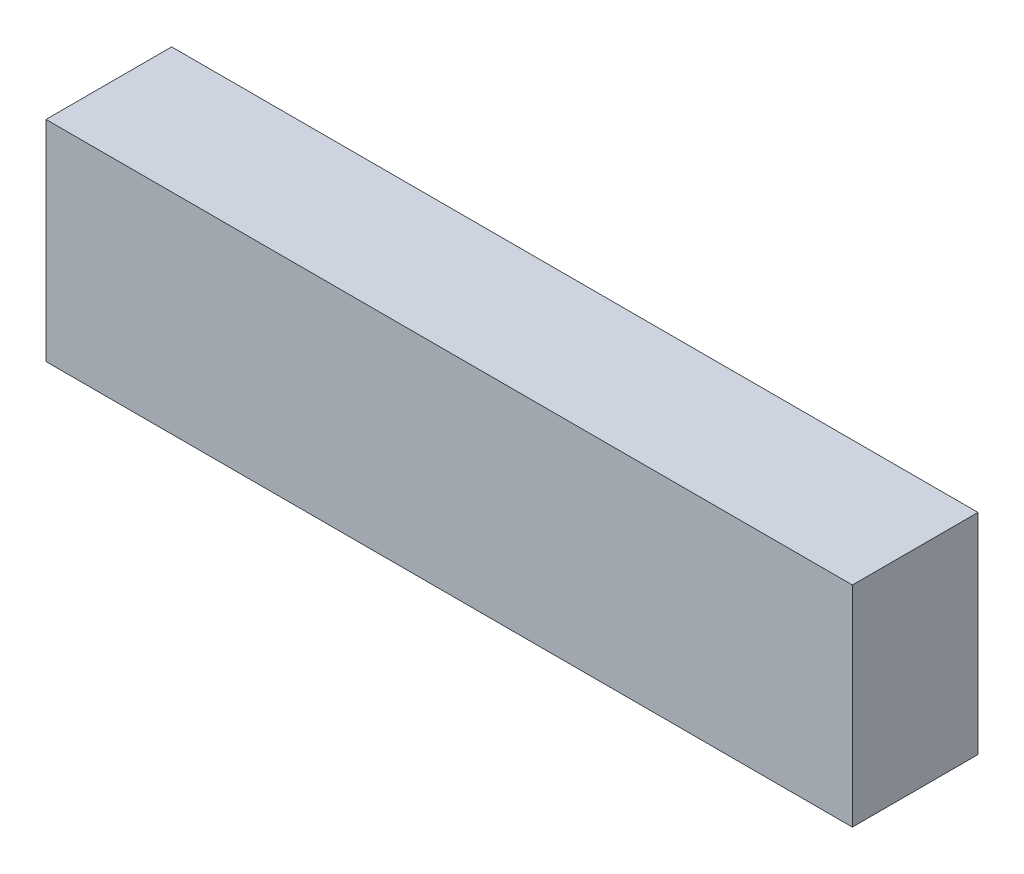
ISO-10303-21;
HEADER;
FILE_DESCRIPTION(('STEP AP214'),'2;1');
FILE_NAME('part.step','',(''),(''),'','','');
FILE_SCHEMA(('AUTOMOTIVE_DESIGN { 1 0 10303 214 1 1 1 1 }'));
ENDSEC;
DATA;
#1=APPLICATION_CONTEXT('core data for automotive mechanical design processes');
#2=APPLICATION_PROTOCOL_DEFINITION('international standard','automotive_design',2000,#1);
#3=PRODUCT_CONTEXT('',#1,'mechanical');
#4=PRODUCT('Part','Part','',(#3));
#5=PRODUCT_RELATED_PRODUCT_CATEGORY('part','',(#4));
#6=PRODUCT_DEFINITION_FORMATION('','',#4);
#7=PRODUCT_DEFINITION_CONTEXT('part definition',#1,'design');
#8=PRODUCT_DEFINITION('design','',#6,#7);
#9=PRODUCT_DEFINITION_SHAPE('','',#8);
#10=(LENGTH_UNIT() NAMED_UNIT(*) SI_UNIT(.MILLI.,.METRE.));
#11=(NAMED_UNIT(*) PLANE_ANGLE_UNIT() SI_UNIT($,.RADIAN.));
#12=(NAMED_UNIT(*) SI_UNIT($,.STERADIAN.) SOLID_ANGLE_UNIT());
#13=UNCERTAINTY_MEASURE_WITH_UNIT(LENGTH_MEASURE(1.E-05),#10,'distance_accuracy_value','');
#14=(GEOMETRIC_REPRESENTATION_CONTEXT(3) GLOBAL_UNCERTAINTY_ASSIGNED_CONTEXT((#13)) GLOBAL_UNIT_ASSIGNED_CONTEXT((#10,
#11,#12)) REPRESENTATION_CONTEXT('',''));
#15=CARTESIAN_POINT('',(0.,0.,0.));
#16=DIRECTION('',(0.,0.,1.));
#17=DIRECTION('',(1.,0.,0.));
#18=AXIS2_PLACEMENT_3D('',#15,#16,#17);
#19=CARTESIAN_POINT('',(32.5045,77.5714301256037,7.25));
#20=DIRECTION('',(1.,0.,0.));
#21=DIRECTION('',(0.,0.,-1.));
#22=AXIS2_PLACEMENT_3D('',#19,#20,#21);
#23=PLANE('',#22);
#24=DIRECTION('',(0.,-1.,0.));
#25=VECTOR('',#24,1.);
#26=CARTESIAN_POINT('',(32.5045,77.5714301256037,0.));
#27=LINE('',#26,#25);
#28=CARTESIAN_POINT('',(32.5045,77.5714301256037,0.));
#29=VERTEX_POINT('',#28);
#30=CARTESIAN_POINT('',(32.5045,65.47,0.));
#31=VERTEX_POINT('',#30);
#32=EDGE_CURVE('E149',#29,#31,#27,.T.);
#33=ORIENTED_EDGE('',*,*,#32,.T.);
#34=DIRECTION('',(0.,0.,-1.));
#35=VECTOR('',#34,1.);
#36=CARTESIAN_POINT('',(32.5045,65.47,7.25));
#37=LINE('',#36,#35);
#38=CARTESIAN_POINT('',(32.5045,65.47,7.25));
#39=VERTEX_POINT('',#38);
#40=EDGE_CURVE('E11',#39,#31,#37,.T.);
#41=ORIENTED_EDGE('',*,*,#40,.F.);
#42=DIRECTION('',(0.,-1.,0.));
#43=VECTOR('',#42,1.);
#44=CARTESIAN_POINT('',(32.5045,77.5714301256037,7.25));
#45=LINE('',#44,#43);
#46=CARTESIAN_POINT('',(32.5045,77.5714301256037,7.25));
#47=VERTEX_POINT('',#46);
#48=EDGE_CURVE('E140',#47,#39,#45,.T.);
#49=ORIENTED_EDGE('',*,*,#48,.F.);
#50=DIRECTION('',(0.,0.,-1.));
#51=VECTOR('',#50,1.);
#52=CARTESIAN_POINT('',(32.5045,77.5714301256037,7.25));
#53=LINE('',#52,#51);
#54=EDGE_CURVE('E55',#47,#29,#53,.T.);
#55=ORIENTED_EDGE('',*,*,#54,.T.);
#56=EDGE_LOOP('',(#33,#41,#49,#55));
#57=FACE_BOUND('',#56,.T.);
#58=ADVANCED_FACE('F32',(#57),#23,.F.);
#59=CARTESIAN_POINT('',(32.5045,65.47,7.25));
#60=DIRECTION('',(0.,1.,0.));
#61=DIRECTION('',(0.,0.,1.));
#62=AXIS2_PLACEMENT_3D('',#59,#60,#61);
#63=PLANE('',#62);
#64=DIRECTION('',(1.,0.,0.));
#65=VECTOR('',#64,1.);
#66=CARTESIAN_POINT('',(32.5045,65.47,0.));
#67=LINE('',#66,#65);
#68=CARTESIAN_POINT('',(79.0368014902547,65.47,0.));
#69=VERTEX_POINT('',#68);
#70=EDGE_CURVE('E151',#31,#69,#67,.T.);
#71=ORIENTED_EDGE('',*,*,#70,.T.);
#72=DIRECTION('',(0.,0.,-1.));
#73=VECTOR('',#72,1.);
#74=CARTESIAN_POINT('',(79.0368014902547,65.47,7.25));
#75=LINE('',#74,#73);
#76=CARTESIAN_POINT('',(79.0368014902547,65.47,7.25));
#77=VERTEX_POINT('',#76);
#78=EDGE_CURVE('E39',#77,#69,#75,.T.);
#79=ORIENTED_EDGE('',*,*,#78,.F.);
#80=DIRECTION('',(1.,0.,0.));
#81=VECTOR('',#80,1.);
#82=CARTESIAN_POINT('',(32.5045,65.47,7.25));
#83=LINE('',#82,#81);
#84=EDGE_CURVE('E81',#39,#77,#83,.T.);
#85=ORIENTED_EDGE('',*,*,#84,.F.);
#86=ORIENTED_EDGE('',*,*,#40,.T.);
#87=EDGE_LOOP('',(#71,#79,#85,#86));
#88=FACE_BOUND('',#87,.T.);
#89=ADVANCED_FACE('F166',(#88),#63,.F.);
#90=CARTESIAN_POINT('',(79.0368014902547,77.5714301256037,7.25));
#91=DIRECTION('',(1.,0.,0.));
#92=DIRECTION('',(0.,0.,-1.));
#93=AXIS2_PLACEMENT_3D('',#90,#91,#92);
#94=PLANE('',#93);
#95=DIRECTION('',(0.,-1.,0.));
#96=VECTOR('',#95,1.);
#97=CARTESIAN_POINT('',(79.0368014902547,77.5714301256037,0.));
#98=LINE('',#97,#96);
#99=CARTESIAN_POINT('',(79.0368014902547,77.5714301256037,0.));
#100=VERTEX_POINT('',#99);
#101=EDGE_CURVE('E155',#100,#69,#98,.T.);
#102=ORIENTED_EDGE('',*,*,#101,.F.);
#103=DIRECTION('',(0.,0.,-1.));
#104=VECTOR('',#103,1.);
#105=CARTESIAN_POINT('',(79.0368014902547,77.5714301256037,7.25));
#106=LINE('',#105,#104);
#107=CARTESIAN_POINT('',(79.0368014902547,77.5714301256037,7.25));
#108=VERTEX_POINT('',#107);
#109=EDGE_CURVE('E161',#108,#100,#106,.T.);
#110=ORIENTED_EDGE('',*,*,#109,.F.);
#111=DIRECTION('',(0.,-1.,0.));
#112=VECTOR('',#111,1.);
#113=CARTESIAN_POINT('',(79.0368014902547,77.5714301256037,7.25));
#114=LINE('',#113,#112);
#115=EDGE_CURVE('E144',#108,#77,#114,.T.);
#116=ORIENTED_EDGE('',*,*,#115,.T.);
#117=ORIENTED_EDGE('',*,*,#78,.T.);
#118=EDGE_LOOP('',(#102,#110,#116,#117));
#119=FACE_BOUND('',#118,.T.);
#120=ADVANCED_FACE('F164',(#119),#94,.T.);
#121=CARTESIAN_POINT('',(32.5045,77.5714301256037,7.25));
#122=DIRECTION('',(0.,1.,0.));
#123=DIRECTION('',(0.,0.,1.));
#124=AXIS2_PLACEMENT_3D('',#121,#122,#123);
#125=PLANE('',#124);
#126=DIRECTION('',(1.,0.,0.));
#127=VECTOR('',#126,1.);
#128=CARTESIAN_POINT('',(32.5045,77.5714301256037,0.));
#129=LINE('',#128,#127);
#130=EDGE_CURVE('E142',#29,#100,#129,.T.);
#131=ORIENTED_EDGE('',*,*,#130,.F.);
#132=ORIENTED_EDGE('',*,*,#54,.F.);
#133=DIRECTION('',(1.,0.,0.));
#134=VECTOR('',#133,1.);
#135=CARTESIAN_POINT('',(32.5045,77.5714301256037,7.25));
#136=LINE('',#135,#134);
#137=EDGE_CURVE('E147',#47,#108,#136,.T.);
#138=ORIENTED_EDGE('',*,*,#137,.T.);
#139=ORIENTED_EDGE('',*,*,#109,.T.);
#140=EDGE_LOOP('',(#131,#132,#138,#139));
#141=FACE_BOUND('',#140,.T.);
#142=ADVANCED_FACE('F170',(#141),#125,.T.);
#143=CARTESIAN_POINT('',(0.,0.,7.25));
#144=DIRECTION('',(0.,0.,1.));
#145=DIRECTION('',(1.,0.,0.));
#146=AXIS2_PLACEMENT_3D('',#143,#144,#145);
#147=PLANE('',#146);
#148=ORIENTED_EDGE('',*,*,#48,.T.);
#149=ORIENTED_EDGE('',*,*,#84,.T.);
#150=ORIENTED_EDGE('',*,*,#115,.F.);
#151=ORIENTED_EDGE('',*,*,#137,.F.);
#152=EDGE_LOOP('',(#148,#149,#150,#151));
#153=FACE_BOUND('',#152,.T.);
#154=ADVANCED_FACE('F173',(#153),#147,.T.);
#155=CARTESIAN_POINT('',(0.,0.,0.));
#156=DIRECTION('',(0.,0.,1.));
#157=DIRECTION('',(1.,0.,0.));
#158=AXIS2_PLACEMENT_3D('',#155,#156,#157);
#159=PLANE('',#158);
#160=DIRECTION('',(1.,0.,0.));
#161=VECTOR('',#160,1.);
#162=CARTESIAN_POINT('',(32.5045,77.0714301256037,0.));
#163=LINE('',#162,#161);
#164=CARTESIAN_POINT('',(33.0045,77.0714301256037,0.));
#165=VERTEX_POINT('',#164);
#166=CARTESIAN_POINT('',(78.5368014902547,77.0714301256037,0.));
#167=VERTEX_POINT('',#166);
#168=EDGE_CURVE('E125',#165,#167,#163,.T.);
#169=ORIENTED_EDGE('',*,*,#168,.F.);
#170=DIRECTION('',(0.,-1.,0.));
#171=VECTOR('',#170,1.);
#172=CARTESIAN_POINT('',(33.0045,77.5714301256037,0.));
#173=LINE('',#172,#171);
#174=CARTESIAN_POINT('',(33.0045,65.97,0.));
#175=VERTEX_POINT('',#174);
#176=EDGE_CURVE('E112',#165,#175,#173,.T.);
#177=ORIENTED_EDGE('',*,*,#176,.T.);
#178=DIRECTION('',(1.,0.,0.));
#179=VECTOR('',#178,1.);
#180=CARTESIAN_POINT('',(32.5045,65.97,0.));
#181=LINE('',#180,#179);
#182=CARTESIAN_POINT('',(78.5368014902547,65.97,0.));
#183=VERTEX_POINT('',#182);
#184=EDGE_CURVE('E135',#175,#183,#181,.T.);
#185=ORIENTED_EDGE('',*,*,#184,.T.);
#186=DIRECTION('',(0.,-1.,0.));
#187=VECTOR('',#186,1.);
#188=CARTESIAN_POINT('',(78.5368014902547,77.5714301256037,0.));
#189=LINE('',#188,#187);
#190=EDGE_CURVE('E46',#167,#183,#189,.T.);
#191=ORIENTED_EDGE('',*,*,#190,.F.);
#192=EDGE_LOOP('',(#169,#177,#185,#191));
#193=FACE_BOUND('',#192,.T.);
#194=ORIENTED_EDGE('',*,*,#32,.F.);
#195=ORIENTED_EDGE('',*,*,#130,.T.);
#196=ORIENTED_EDGE('',*,*,#101,.T.);
#197=ORIENTED_EDGE('',*,*,#70,.F.);
#198=EDGE_LOOP('',(#194,#195,#196,#197));
#199=FACE_BOUND('',#198,.T.);
#200=ADVANCED_FACE('F169',(#193,#199),#159,.F.);
#201=CARTESIAN_POINT('',(33.0045,77.5714301256037,7.25));
#202=DIRECTION('',(1.,0.,0.));
#203=DIRECTION('',(0.,0.,-1.));
#204=AXIS2_PLACEMENT_3D('',#201,#202,#203);
#205=PLANE('',#204);
#206=ORIENTED_EDGE('',*,*,#176,.F.);
#207=DIRECTION('',(0.,0.,-1.));
#208=VECTOR('',#207,1.);
#209=CARTESIAN_POINT('',(33.0045,77.0714301256037,7.25));
#210=LINE('',#209,#208);
#211=CARTESIAN_POINT('',(33.0045,77.0714301256037,7.05));
#212=VERTEX_POINT('',#211);
#213=EDGE_CURVE('E105',#212,#165,#210,.T.);
#214=ORIENTED_EDGE('',*,*,#213,.F.);
#215=DIRECTION('',(0.,-1.,0.));
#216=VECTOR('',#215,1.);
#217=CARTESIAN_POINT('',(33.0045,77.5714301256037,7.05));
#218=LINE('',#217,#216);
#219=CARTESIAN_POINT('',(33.0045,65.97,7.05));
#220=VERTEX_POINT('',#219);
#221=EDGE_CURVE('E109',#212,#220,#218,.T.);
#222=ORIENTED_EDGE('',*,*,#221,.T.);
#223=DIRECTION('',(0.,0.,-1.));
#224=VECTOR('',#223,1.);
#225=CARTESIAN_POINT('',(33.0045,65.97,7.25));
#226=LINE('',#225,#224);
#227=EDGE_CURVE('E152',#220,#175,#226,.T.);
#228=ORIENTED_EDGE('',*,*,#227,.T.);
#229=EDGE_LOOP('',(#206,#214,#222,#228));
#230=FACE_BOUND('',#229,.T.);
#231=ADVANCED_FACE('F107',(#230),#205,.T.);
#232=CARTESIAN_POINT('',(32.5045,65.97,7.25));
#233=DIRECTION('',(0.,1.,0.));
#234=DIRECTION('',(0.,0.,1.));
#235=AXIS2_PLACEMENT_3D('',#232,#233,#234);
#236=PLANE('',#235);
#237=ORIENTED_EDGE('',*,*,#184,.F.);
#238=ORIENTED_EDGE('',*,*,#227,.F.);
#239=DIRECTION('',(1.,0.,0.));
#240=VECTOR('',#239,1.);
#241=CARTESIAN_POINT('',(32.5045,65.97,7.05));
#242=LINE('',#241,#240);
#243=CARTESIAN_POINT('',(78.5368014902547,65.97,7.05));
#244=VERTEX_POINT('',#243);
#245=EDGE_CURVE('E124',#220,#244,#242,.T.);
#246=ORIENTED_EDGE('',*,*,#245,.T.);
#247=DIRECTION('',(0.,0.,-1.));
#248=VECTOR('',#247,1.);
#249=CARTESIAN_POINT('',(78.5368014902547,65.97,7.25));
#250=LINE('',#249,#248);
#251=EDGE_CURVE('E264',#244,#183,#250,.T.);
#252=ORIENTED_EDGE('',*,*,#251,.T.);
#253=EDGE_LOOP('',(#237,#238,#246,#252));
#254=FACE_BOUND('',#253,.T.);
#255=ADVANCED_FACE('F197',(#254),#236,.T.);
#256=CARTESIAN_POINT('',(78.5368014902547,77.5714301256037,7.25));
#257=DIRECTION('',(1.,0.,0.));
#258=DIRECTION('',(0.,0.,-1.));
#259=AXIS2_PLACEMENT_3D('',#256,#257,#258);
#260=PLANE('',#259);
#261=ORIENTED_EDGE('',*,*,#190,.T.);
#262=ORIENTED_EDGE('',*,*,#251,.F.);
#263=DIRECTION('',(0.,-1.,0.));
#264=VECTOR('',#263,1.);
#265=CARTESIAN_POINT('',(78.5368014902547,77.5714301256037,7.05));
#266=LINE('',#265,#264);
#267=CARTESIAN_POINT('',(78.5368014902547,77.0714301256037,7.05));
#268=VERTEX_POINT('',#267);
#269=EDGE_CURVE('E129',#268,#244,#266,.T.);
#270=ORIENTED_EDGE('',*,*,#269,.F.);
#271=DIRECTION('',(0.,0.,-1.));
#272=VECTOR('',#271,1.);
#273=CARTESIAN_POINT('',(78.5368014902547,77.0714301256037,7.25));
#274=LINE('',#273,#272);
#275=EDGE_CURVE('E117',#268,#167,#274,.T.);
#276=ORIENTED_EDGE('',*,*,#275,.T.);
#277=EDGE_LOOP('',(#261,#262,#270,#276));
#278=FACE_BOUND('',#277,.T.);
#279=ADVANCED_FACE('F194',(#278),#260,.F.);
#280=CARTESIAN_POINT('',(32.5045,77.0714301256037,7.25));
#281=DIRECTION('',(0.,1.,0.));
#282=DIRECTION('',(0.,0.,1.));
#283=AXIS2_PLACEMENT_3D('',#280,#281,#282);
#284=PLANE('',#283);
#285=ORIENTED_EDGE('',*,*,#168,.T.);
#286=ORIENTED_EDGE('',*,*,#275,.F.);
#287=DIRECTION('',(1.,0.,0.));
#288=VECTOR('',#287,1.);
#289=CARTESIAN_POINT('',(32.5045,77.0714301256037,7.05));
#290=LINE('',#289,#288);
#291=EDGE_CURVE('E118',#212,#268,#290,.T.);
#292=ORIENTED_EDGE('',*,*,#291,.F.);
#293=ORIENTED_EDGE('',*,*,#213,.T.);
#294=EDGE_LOOP('',(#285,#286,#292,#293));
#295=FACE_BOUND('',#294,.T.);
#296=ADVANCED_FACE('F127',(#295),#284,.F.);
#297=CARTESIAN_POINT('',(0.,0.,7.05));
#298=DIRECTION('',(0.,0.,1.));
#299=DIRECTION('',(1.,0.,0.));
#300=AXIS2_PLACEMENT_3D('',#297,#298,#299);
#301=PLANE('',#300);
#302=ORIENTED_EDGE('',*,*,#221,.F.);
#303=ORIENTED_EDGE('',*,*,#291,.T.);
#304=ORIENTED_EDGE('',*,*,#269,.T.);
#305=ORIENTED_EDGE('',*,*,#245,.F.);
#306=EDGE_LOOP('',(#302,#303,#304,#305));
#307=FACE_BOUND('',#306,.T.);
#308=ADVANCED_FACE('F122',(#307),#301,.F.);
#309=CLOSED_SHELL('',(#58,#89,#120,#142,#154,#200,#231,#255,#279,#296,#308));
#310=MANIFOLD_SOLID_BREP('B2',#309);
#311=ADVANCED_BREP_SHAPE_REPRESENTATION('',(#18,#310),#14);
#312=SHAPE_DEFINITION_REPRESENTATION(#9,#311);
ENDSEC;
END-ISO-10303-21;
